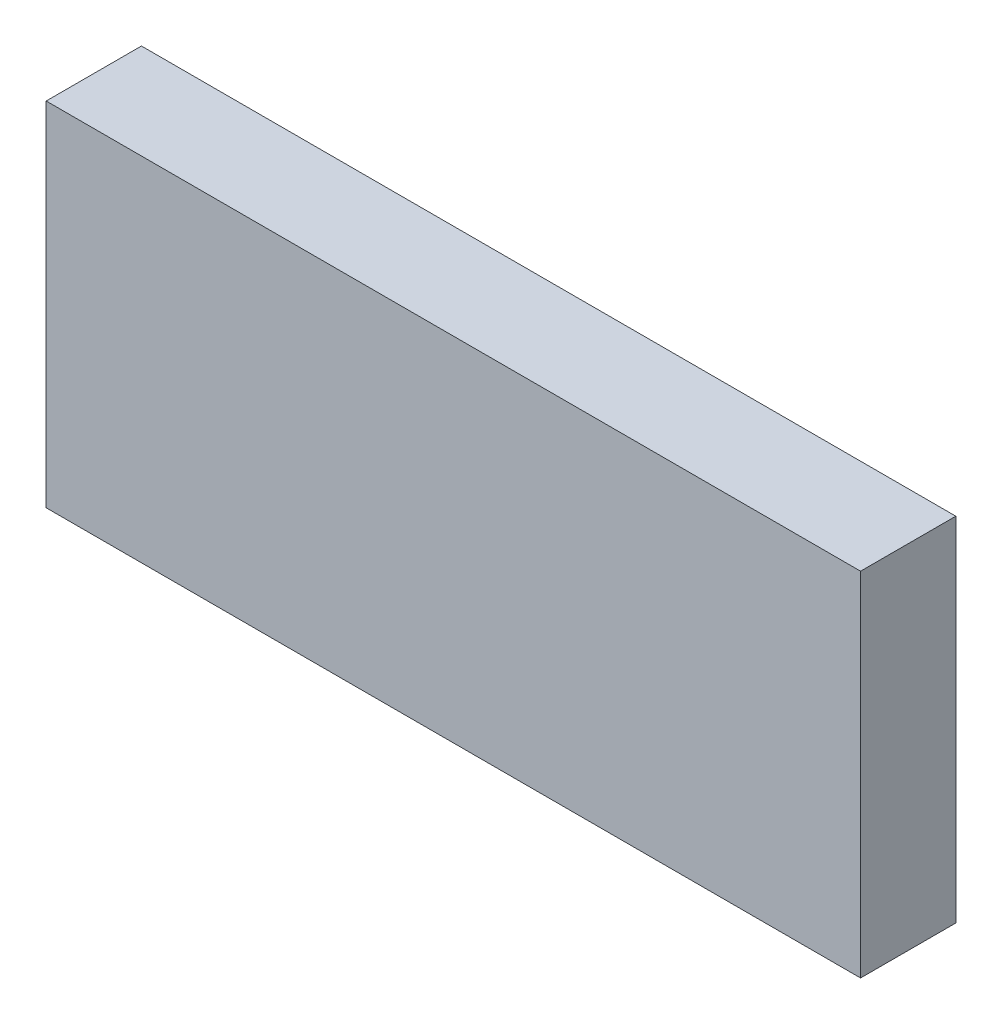
ISO-10303-21;
HEADER;
FILE_DESCRIPTION(('STEP AP214'),'2;1');
FILE_NAME('part.step','',(''),(''),'','','');
FILE_SCHEMA(('AUTOMOTIVE_DESIGN { 1 0 10303 214 1 1 1 1 }'));
ENDSEC;
DATA;
#1=APPLICATION_CONTEXT('core data for automotive mechanical design processes');
#2=APPLICATION_PROTOCOL_DEFINITION('international standard','automotive_design',2000,#1);
#3=PRODUCT_CONTEXT('',#1,'mechanical');
#4=PRODUCT('Part','Part','',(#3));
#5=PRODUCT_RELATED_PRODUCT_CATEGORY('part','',(#4));
#6=PRODUCT_DEFINITION_FORMATION('','',#4);
#7=PRODUCT_DEFINITION_CONTEXT('part definition',#1,'design');
#8=PRODUCT_DEFINITION('design','',#6,#7);
#9=PRODUCT_DEFINITION_SHAPE('','',#8);
#10=(LENGTH_UNIT() NAMED_UNIT(*) SI_UNIT(.MILLI.,.METRE.));
#11=(NAMED_UNIT(*) PLANE_ANGLE_UNIT() SI_UNIT($,.RADIAN.));
#12=(NAMED_UNIT(*) SI_UNIT($,.STERADIAN.) SOLID_ANGLE_UNIT());
#13=UNCERTAINTY_MEASURE_WITH_UNIT(LENGTH_MEASURE(1.E-05),#10,'distance_accuracy_value','');
#14=(GEOMETRIC_REPRESENTATION_CONTEXT(3) GLOBAL_UNCERTAINTY_ASSIGNED_CONTEXT((#13)) GLOBAL_UNIT_ASSIGNED_CONTEXT((#10,
#11,#12)) REPRESENTATION_CONTEXT('',''));
#15=CARTESIAN_POINT('',(0.,0.,0.));
#16=DIRECTION('',(0.,0.,1.));
#17=DIRECTION('',(1.,0.,0.));
#18=AXIS2_PLACEMENT_3D('',#15,#16,#17);
#19=CARTESIAN_POINT('',(42.7490472266244,18.4942686583269,10.));
#20=DIRECTION('',(0.,-1.,0.));
#21=DIRECTION('',(0.,0.,-1.));
#22=AXIS2_PLACEMENT_3D('',#19,#20,#21);
#23=PLANE('',#22);
#24=DIRECTION('',(-1.,0.,0.));
#25=VECTOR('',#24,1.);
#26=CARTESIAN_POINT('',(42.7490472266244,18.4942686583269,0.));
#27=LINE('',#26,#25);
#28=CARTESIAN_POINT('',(42.7490472266244,18.4942686583269,0.));
#29=VERTEX_POINT('',#28);
#30=CARTESIAN_POINT('',(-42.7490472266244,18.4942686583269,0.));
#31=VERTEX_POINT('',#30);
#32=EDGE_CURVE('E111',#29,#31,#27,.T.);
#33=ORIENTED_EDGE('',*,*,#32,.T.);
#34=DIRECTION('',(0.,0.,-1.));
#35=VECTOR('',#34,1.);
#36=CARTESIAN_POINT('',(-42.7490472266244,18.4942686583269,10.));
#37=LINE('',#36,#35);
#38=CARTESIAN_POINT('',(-42.7490472266244,18.4942686583269,10.));
#39=VERTEX_POINT('',#38);
#40=EDGE_CURVE('E11',#39,#31,#37,.T.);
#41=ORIENTED_EDGE('',*,*,#40,.F.);
#42=DIRECTION('',(-1.,0.,0.));
#43=VECTOR('',#42,1.);
#44=CARTESIAN_POINT('',(42.7490472266244,18.4942686583269,10.));
#45=LINE('',#44,#43);
#46=CARTESIAN_POINT('',(42.7490472266244,18.4942686583269,10.));
#47=VERTEX_POINT('',#46);
#48=EDGE_CURVE('E100',#47,#39,#45,.T.);
#49=ORIENTED_EDGE('',*,*,#48,.F.);
#50=DIRECTION('',(0.,0.,-1.));
#51=VECTOR('',#50,1.);
#52=CARTESIAN_POINT('',(42.7490472266244,18.4942686583269,10.));
#53=LINE('',#52,#51);
#54=EDGE_CURVE('E108',#47,#29,#53,.T.);
#55=ORIENTED_EDGE('',*,*,#54,.T.);
#56=EDGE_LOOP('',(#33,#41,#49,#55));
#57=FACE_BOUND('',#56,.T.);
#58=ADVANCED_FACE('F44',(#57),#23,.F.);
#59=CARTESIAN_POINT('',(-42.7490472266244,-18.4942686583269,10.));
#60=DIRECTION('',(1.,0.,0.));
#61=DIRECTION('',(0.,0.,-1.));
#62=AXIS2_PLACEMENT_3D('',#59,#60,#61);
#63=PLANE('',#62);
#64=DIRECTION('',(0.,-1.,0.));
#65=VECTOR('',#64,1.);
#66=CARTESIAN_POINT('',(-42.7490472266244,-18.4942686583269,0.));
#67=LINE('',#66,#65);
#68=CARTESIAN_POINT('',(-42.7490472266244,-18.4942686583269,0.));
#69=VERTEX_POINT('',#68);
#70=EDGE_CURVE('E105',#31,#69,#67,.T.);
#71=ORIENTED_EDGE('',*,*,#70,.T.);
#72=DIRECTION('',(0.,0.,-1.));
#73=VECTOR('',#72,1.);
#74=CARTESIAN_POINT('',(-42.7490472266244,-18.4942686583269,10.));
#75=LINE('',#74,#73);
#76=CARTESIAN_POINT('',(-42.7490472266244,-18.4942686583269,10.));
#77=VERTEX_POINT('',#76);
#78=EDGE_CURVE('E53',#77,#69,#75,.T.);
#79=ORIENTED_EDGE('',*,*,#78,.F.);
#80=DIRECTION('',(0.,-1.,0.));
#81=VECTOR('',#80,1.);
#82=CARTESIAN_POINT('',(-42.7490472266244,-18.4942686583269,10.));
#83=LINE('',#82,#81);
#84=EDGE_CURVE('E95',#39,#77,#83,.T.);
#85=ORIENTED_EDGE('',*,*,#84,.F.);
#86=ORIENTED_EDGE('',*,*,#40,.T.);
#87=EDGE_LOOP('',(#71,#79,#85,#86));
#88=FACE_BOUND('',#87,.T.);
#89=ADVANCED_FACE('F102',(#88),#63,.F.);
#90=CARTESIAN_POINT('',(42.7490472266244,-18.4942686583269,10.));
#91=DIRECTION('',(0.,1.,0.));
#92=DIRECTION('',(0.,0.,1.));
#93=AXIS2_PLACEMENT_3D('',#90,#91,#92);
#94=PLANE('',#93);
#95=DIRECTION('',(1.,0.,0.));
#96=VECTOR('',#95,1.);
#97=CARTESIAN_POINT('',(42.7490472266244,-18.4942686583269,0.));
#98=LINE('',#97,#96);
#99=CARTESIAN_POINT('',(42.7490472266244,-18.4942686583269,0.));
#100=VERTEX_POINT('',#99);
#101=EDGE_CURVE('E80',#69,#100,#98,.T.);
#102=ORIENTED_EDGE('',*,*,#101,.T.);
#103=DIRECTION('',(0.,0.,-1.));
#104=VECTOR('',#103,1.);
#105=CARTESIAN_POINT('',(42.7490472266244,-18.4942686583269,10.));
#106=LINE('',#105,#104);
#107=CARTESIAN_POINT('',(42.7490472266244,-18.4942686583269,10.));
#108=VERTEX_POINT('',#107);
#109=EDGE_CURVE('E101',#108,#100,#106,.T.);
#110=ORIENTED_EDGE('',*,*,#109,.F.);
#111=DIRECTION('',(1.,0.,0.));
#112=VECTOR('',#111,1.);
#113=CARTESIAN_POINT('',(42.7490472266244,-18.4942686583269,10.));
#114=LINE('',#113,#112);
#115=EDGE_CURVE('E94',#77,#108,#114,.T.);
#116=ORIENTED_EDGE('',*,*,#115,.F.);
#117=ORIENTED_EDGE('',*,*,#78,.T.);
#118=EDGE_LOOP('',(#102,#110,#116,#117));
#119=FACE_BOUND('',#118,.T.);
#120=ADVANCED_FACE('F103',(#119),#94,.F.);
#121=CARTESIAN_POINT('',(42.7490472266244,-18.4942686583269,10.));
#122=DIRECTION('',(-1.,0.,0.));
#123=DIRECTION('',(0.,0.,1.));
#124=AXIS2_PLACEMENT_3D('',#121,#122,#123);
#125=PLANE('',#124);
#126=DIRECTION('',(0.,1.,0.));
#127=VECTOR('',#126,1.);
#128=CARTESIAN_POINT('',(42.7490472266244,-18.4942686583269,0.));
#129=LINE('',#128,#127);
#130=EDGE_CURVE('E82',#100,#29,#129,.T.);
#131=ORIENTED_EDGE('',*,*,#130,.T.);
#132=ORIENTED_EDGE('',*,*,#54,.F.);
#133=DIRECTION('',(0.,1.,0.));
#134=VECTOR('',#133,1.);
#135=CARTESIAN_POINT('',(42.7490472266244,-18.4942686583269,10.));
#136=LINE('',#135,#134);
#137=EDGE_CURVE('E62',#108,#47,#136,.T.);
#138=ORIENTED_EDGE('',*,*,#137,.F.);
#139=ORIENTED_EDGE('',*,*,#109,.T.);
#140=EDGE_LOOP('',(#131,#132,#138,#139));
#141=FACE_BOUND('',#140,.T.);
#142=ADVANCED_FACE('F128',(#141),#125,.F.);
#143=CARTESIAN_POINT('',(0.,0.,10.));
#144=DIRECTION('',(0.,0.,-1.));
#145=DIRECTION('',(-1.,0.,0.));
#146=AXIS2_PLACEMENT_3D('',#143,#144,#145);
#147=PLANE('',#146);
#148=ORIENTED_EDGE('',*,*,#48,.T.);
#149=ORIENTED_EDGE('',*,*,#84,.T.);
#150=ORIENTED_EDGE('',*,*,#115,.T.);
#151=ORIENTED_EDGE('',*,*,#137,.T.);
#152=EDGE_LOOP('',(#148,#149,#150,#151));
#153=FACE_BOUND('',#152,.T.);
#154=ADVANCED_FACE('F93',(#153),#147,.F.);
#155=CARTESIAN_POINT('',(0.,0.,0.));
#156=DIRECTION('',(0.,0.,-1.));
#157=DIRECTION('',(-1.,0.,0.));
#158=AXIS2_PLACEMENT_3D('',#155,#156,#157);
#159=PLANE('',#158);
#160=ORIENTED_EDGE('',*,*,#32,.F.);
#161=ORIENTED_EDGE('',*,*,#130,.F.);
#162=ORIENTED_EDGE('',*,*,#101,.F.);
#163=ORIENTED_EDGE('',*,*,#70,.F.);
#164=EDGE_LOOP('',(#160,#161,#162,#163));
#165=FACE_BOUND('',#164,.T.);
#166=ADVANCED_FACE('F129',(#165),#159,.T.);
#167=CLOSED_SHELL('',(#58,#89,#120,#142,#154,#166));
#168=MANIFOLD_SOLID_BREP('B2',#167);
#169=ADVANCED_BREP_SHAPE_REPRESENTATION('',(#18,#168),#14);
#170=SHAPE_DEFINITION_REPRESENTATION(#9,#169);
ENDSEC;
END-ISO-10303-21;
